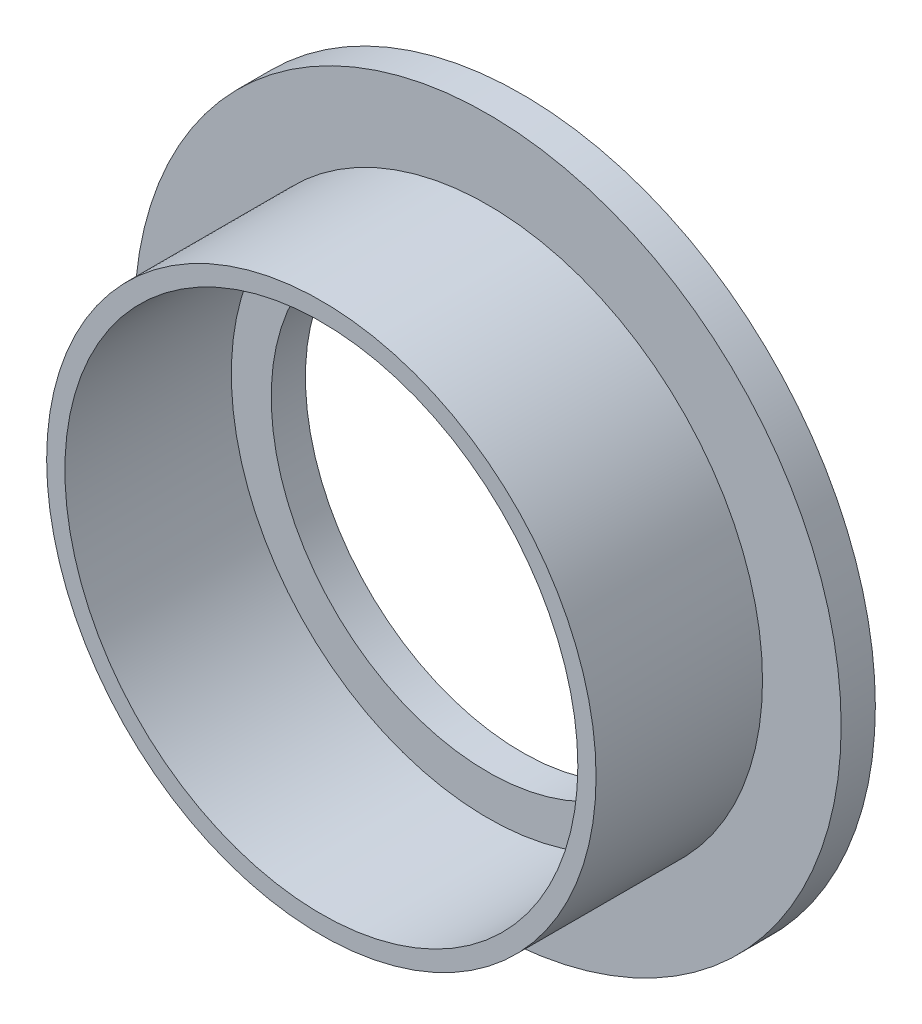
ISO-10303-21;
HEADER;
FILE_DESCRIPTION(('STEP AP214'),'2;1');
FILE_NAME('part.step','',(''),(''),'','','');
FILE_SCHEMA(('AUTOMOTIVE_DESIGN { 1 0 10303 214 1 1 1 1 }'));
ENDSEC;
DATA;
#1=APPLICATION_CONTEXT('core data for automotive mechanical design processes');
#2=APPLICATION_PROTOCOL_DEFINITION('international standard','automotive_design',2000,#1);
#3=PRODUCT_CONTEXT('',#1,'mechanical');
#4=PRODUCT('Part','Part','',(#3));
#5=PRODUCT_RELATED_PRODUCT_CATEGORY('part','',(#4));
#6=PRODUCT_DEFINITION_FORMATION('','',#4);
#7=PRODUCT_DEFINITION_CONTEXT('part definition',#1,'design');
#8=PRODUCT_DEFINITION('design','',#6,#7);
#9=PRODUCT_DEFINITION_SHAPE('','',#8);
#10=(LENGTH_UNIT() NAMED_UNIT(*) SI_UNIT(.MILLI.,.METRE.));
#11=(NAMED_UNIT(*) PLANE_ANGLE_UNIT() SI_UNIT($,.RADIAN.));
#12=(NAMED_UNIT(*) SI_UNIT($,.STERADIAN.) SOLID_ANGLE_UNIT());
#13=UNCERTAINTY_MEASURE_WITH_UNIT(LENGTH_MEASURE(1.E-05),#10,'distance_accuracy_value','');
#14=(GEOMETRIC_REPRESENTATION_CONTEXT(3) GLOBAL_UNCERTAINTY_ASSIGNED_CONTEXT((#13)) GLOBAL_UNIT_ASSIGNED_CONTEXT((#10,
#11,#12)) REPRESENTATION_CONTEXT('',''));
#15=CARTESIAN_POINT('',(0.,0.,0.));
#16=DIRECTION('',(0.,0.,1.));
#17=DIRECTION('',(1.,0.,0.));
#18=AXIS2_PLACEMENT_3D('',#15,#16,#17);
#19=CARTESIAN_POINT('',(0.,0.,1.5));
#20=DIRECTION('',(0.,0.,1.));
#21=DIRECTION('',(1.,0.,0.));
#22=AXIS2_PLACEMENT_3D('',#19,#20,#21);
#23=PLANE('',#22);
#24=CARTESIAN_POINT('',(0.,0.,1.5));
#25=DIRECTION('',(0.,0.,1.));
#26=DIRECTION('',(1.,0.,0.));
#27=AXIS2_PLACEMENT_3D('',#24,#25,#26);
#28=CIRCLE('',#27,15.5);
#29=CARTESIAN_POINT('',(15.5,0.,1.5));
#30=VERTEX_POINT('',#29);
#31=EDGE_CURVE('E38',#30,#30,#28,.T.);
#32=ORIENTED_EDGE('',*,*,#31,.T.);
#33=EDGE_LOOP('',(#32));
#34=FACE_BOUND('',#33,.T.);
#35=CARTESIAN_POINT('',(0.,0.,1.5));
#36=DIRECTION('',(0.,0.,1.));
#37=DIRECTION('',(1.,0.,0.));
#38=AXIS2_PLACEMENT_3D('',#35,#36,#37);
#39=CIRCLE('',#38,12.05);
#40=CARTESIAN_POINT('',(12.05,0.,1.5));
#41=VERTEX_POINT('',#40);
#42=EDGE_CURVE('E55',#41,#41,#39,.T.);
#43=ORIENTED_EDGE('',*,*,#42,.F.);
#44=EDGE_LOOP('',(#43));
#45=FACE_BOUND('',#44,.T.);
#46=ADVANCED_FACE('F31',(#34,#45),#23,.T.);
#47=CARTESIAN_POINT('',(0.,0.,1.5));
#48=DIRECTION('',(0.,0.,1.));
#49=DIRECTION('',(1.,0.,0.));
#50=AXIS2_PLACEMENT_3D('',#47,#48,#49);
#51=CIRCLE('',#50,11.25);
#52=CARTESIAN_POINT('',(11.25,0.,1.5));
#53=VERTEX_POINT('',#52);
#54=EDGE_CURVE('E10',#53,#53,#51,.F.);
#55=ORIENTED_EDGE('',*,*,#54,.F.);
#56=EDGE_LOOP('',(#55));
#57=FACE_BOUND('',#56,.T.);
#58=CARTESIAN_POINT('',(0.,0.,1.5));
#59=DIRECTION('',(0.,0.,1.));
#60=DIRECTION('',(1.,0.,0.));
#61=AXIS2_PLACEMENT_3D('',#58,#59,#60);
#62=CIRCLE('',#61,9.5);
#63=CARTESIAN_POINT('',(9.5,0.,1.5));
#64=VERTEX_POINT('',#63);
#65=EDGE_CURVE('E47',#64,#64,#62,.T.);
#66=ORIENTED_EDGE('',*,*,#65,.F.);
#67=EDGE_LOOP('',(#66));
#68=FACE_BOUND('',#67,.T.);
#69=ADVANCED_FACE('F82',(#57,#68),#23,.T.);
#70=CARTESIAN_POINT('',(0.,0.,0.));
#71=DIRECTION('',(0.,0.,1.));
#72=DIRECTION('',(1.,0.,0.));
#73=AXIS2_PLACEMENT_3D('',#70,#71,#72);
#74=PLANE('',#73);
#75=CARTESIAN_POINT('',(0.,0.,0.));
#76=DIRECTION('',(0.,0.,1.));
#77=DIRECTION('',(1.,0.,0.));
#78=AXIS2_PLACEMENT_3D('',#75,#76,#77);
#79=CIRCLE('',#78,15.5);
#80=CARTESIAN_POINT('',(15.5,0.,0.));
#81=VERTEX_POINT('',#80);
#82=EDGE_CURVE('E42',#81,#81,#79,.T.);
#83=ORIENTED_EDGE('',*,*,#82,.F.);
#84=EDGE_LOOP('',(#83));
#85=FACE_BOUND('',#84,.T.);
#86=CARTESIAN_POINT('',(0.,0.,0.));
#87=DIRECTION('',(0.,0.,1.));
#88=DIRECTION('',(1.,0.,0.));
#89=AXIS2_PLACEMENT_3D('',#86,#87,#88);
#90=CIRCLE('',#89,9.5);
#91=CARTESIAN_POINT('',(9.5,0.,0.));
#92=VERTEX_POINT('',#91);
#93=EDGE_CURVE('E49',#92,#92,#90,.T.);
#94=ORIENTED_EDGE('',*,*,#93,.T.);
#95=EDGE_LOOP('',(#94));
#96=FACE_BOUND('',#95,.T.);
#97=ADVANCED_FACE('F87',(#85,#96),#74,.F.);
#98=CARTESIAN_POINT('',(0.,0.,1.5));
#99=DIRECTION('',(0.,0.,-1.));
#100=DIRECTION('',(-1.,0.,0.));
#101=AXIS2_PLACEMENT_3D('',#98,#99,#100);
#102=CYLINDRICAL_SURFACE('',#101,15.5);
#103=ORIENTED_EDGE('',*,*,#31,.F.);
#104=EDGE_LOOP('',(#103));
#105=FACE_BOUND('',#104,.T.);
#106=ORIENTED_EDGE('',*,*,#82,.T.);
#107=EDGE_LOOP('',(#106));
#108=FACE_BOUND('',#107,.T.);
#109=ADVANCED_FACE('F33',(#105,#108),#102,.T.);
#110=CARTESIAN_POINT('',(0.,0.,1.5));
#111=DIRECTION('',(0.,0.,-1.));
#112=DIRECTION('',(-1.,0.,0.));
#113=AXIS2_PLACEMENT_3D('',#110,#111,#112);
#114=CYLINDRICAL_SURFACE('',#113,9.5);
#115=ORIENTED_EDGE('',*,*,#65,.T.);
#116=EDGE_LOOP('',(#115));
#117=FACE_BOUND('',#116,.T.);
#118=ORIENTED_EDGE('',*,*,#93,.F.);
#119=EDGE_LOOP('',(#118));
#120=FACE_BOUND('',#119,.T.);
#121=ADVANCED_FACE('F69',(#117,#120),#114,.F.);
#122=CARTESIAN_POINT('',(0.,0.,8.8));
#123=DIRECTION('',(0.,0.,1.));
#124=DIRECTION('',(1.,0.,0.));
#125=AXIS2_PLACEMENT_3D('',#122,#123,#124);
#126=PLANE('',#125);
#127=CARTESIAN_POINT('',(0.,0.,8.8));
#128=DIRECTION('',(0.,0.,1.));
#129=DIRECTION('',(1.,0.,0.));
#130=AXIS2_PLACEMENT_3D('',#127,#128,#129);
#131=CIRCLE('',#130,12.05);
#132=CARTESIAN_POINT('',(12.05,0.,8.8));
#133=VERTEX_POINT('',#132);
#134=EDGE_CURVE('E52',#133,#133,#131,.T.);
#135=ORIENTED_EDGE('',*,*,#134,.T.);
#136=EDGE_LOOP('',(#135));
#137=FACE_BOUND('',#136,.T.);
#138=CARTESIAN_POINT('',(0.,0.,8.8));
#139=DIRECTION('',(0.,0.,1.));
#140=DIRECTION('',(1.,0.,0.));
#141=AXIS2_PLACEMENT_3D('',#138,#139,#140);
#142=CIRCLE('',#141,11.25);
#143=CARTESIAN_POINT('',(11.25,0.,8.8));
#144=VERTEX_POINT('',#143);
#145=EDGE_CURVE('E58',#144,#144,#142,.T.);
#146=ORIENTED_EDGE('',*,*,#145,.F.);
#147=EDGE_LOOP('',(#146));
#148=FACE_BOUND('',#147,.T.);
#149=ADVANCED_FACE('F66',(#137,#148),#126,.T.);
#150=CARTESIAN_POINT('',(0.,0.,8.8));
#151=DIRECTION('',(0.,0.,-1.));
#152=DIRECTION('',(-1.,0.,0.));
#153=AXIS2_PLACEMENT_3D('',#150,#151,#152);
#154=CYLINDRICAL_SURFACE('',#153,12.05);
#155=ORIENTED_EDGE('',*,*,#134,.F.);
#156=EDGE_LOOP('',(#155));
#157=FACE_BOUND('',#156,.T.);
#158=ORIENTED_EDGE('',*,*,#42,.T.);
#159=EDGE_LOOP('',(#158));
#160=FACE_BOUND('',#159,.T.);
#161=ADVANCED_FACE('F68',(#157,#160),#154,.T.);
#162=CARTESIAN_POINT('',(0.,0.,8.8));
#163=DIRECTION('',(0.,0.,-1.));
#164=DIRECTION('',(-1.,0.,0.));
#165=AXIS2_PLACEMENT_3D('',#162,#163,#164);
#166=CYLINDRICAL_SURFACE('',#165,11.25);
#167=ORIENTED_EDGE('',*,*,#145,.T.);
#168=EDGE_LOOP('',(#167));
#169=FACE_BOUND('',#168,.T.);
#170=ORIENTED_EDGE('',*,*,#54,.T.);
#171=EDGE_LOOP('',(#170));
#172=FACE_BOUND('',#171,.T.);
#173=ADVANCED_FACE('F64',(#169,#172),#166,.F.);
#174=CLOSED_SHELL('',(#46,#69,#97,#109,#121,#149,#161,#173));
#175=MANIFOLD_SOLID_BREP('B2',#174);
#176=ADVANCED_BREP_SHAPE_REPRESENTATION('',(#18,#175),#14);
#177=SHAPE_DEFINITION_REPRESENTATION(#9,#176);
ENDSEC;
END-ISO-10303-21;
